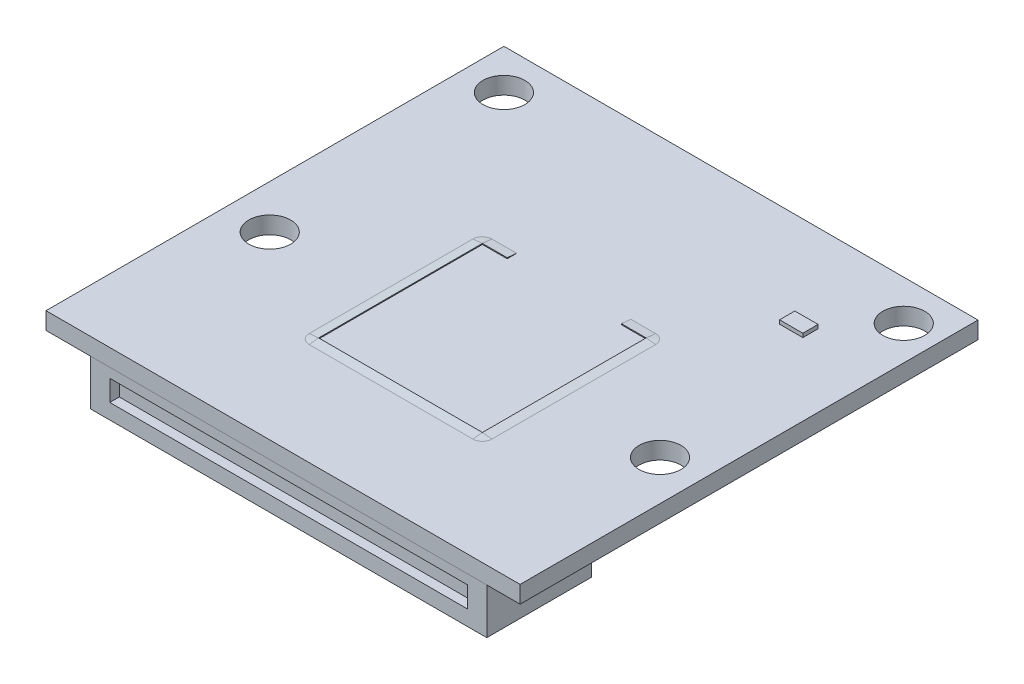
ISO-10303-21;
HEADER;
FILE_DESCRIPTION(('STEP AP214'),'2;1');
FILE_NAME('part.step','',(''),(''),'','','');
FILE_SCHEMA(('AUTOMOTIVE_DESIGN { 1 0 10303 214 1 1 1 1 }'));
ENDSEC;
DATA;
#1=APPLICATION_CONTEXT('core data for automotive mechanical design processes');
#2=APPLICATION_PROTOCOL_DEFINITION('international standard','automotive_design',2000,#1);
#3=PRODUCT_CONTEXT('',#1,'mechanical');
#4=PRODUCT('Part','Part','',(#3));
#5=PRODUCT_RELATED_PRODUCT_CATEGORY('part','',(#4));
#6=PRODUCT_DEFINITION_FORMATION('','',#4);
#7=PRODUCT_DEFINITION_CONTEXT('part definition',#1,'design');
#8=PRODUCT_DEFINITION('design','',#6,#7);
#9=PRODUCT_DEFINITION_SHAPE('','',#8);
#10=(LENGTH_UNIT() NAMED_UNIT(*) SI_UNIT(.MILLI.,.METRE.));
#11=(NAMED_UNIT(*) PLANE_ANGLE_UNIT() SI_UNIT($,.RADIAN.));
#12=(NAMED_UNIT(*) SI_UNIT($,.STERADIAN.) SOLID_ANGLE_UNIT());
#13=UNCERTAINTY_MEASURE_WITH_UNIT(LENGTH_MEASURE(1.E-05),#10,'distance_accuracy_value','');
#14=(GEOMETRIC_REPRESENTATION_CONTEXT(3) GLOBAL_UNCERTAINTY_ASSIGNED_CONTEXT((#13)) GLOBAL_UNIT_ASSIGNED_CONTEXT((#10,
#11,#12)) REPRESENTATION_CONTEXT('',''));
#15=CARTESIAN_POINT('',(0.,0.,0.));
#16=DIRECTION('',(0.,0.,1.));
#17=DIRECTION('',(1.,0.,0.));
#18=AXIS2_PLACEMENT_3D('',#15,#16,#17);
#19=CARTESIAN_POINT('',(-12.75,-0.9,10.17));
#20=DIRECTION('',(0.,0.,1.));
#21=DIRECTION('',(1.,0.,0.));
#22=AXIS2_PLACEMENT_3D('',#19,#20,#21);
#23=PLANE('',#22);
#24=DIRECTION('',(0.,-1.,0.));
#25=VECTOR('',#24,1.);
#26=CARTESIAN_POINT('',(-9.4,-1.4,10.17));
#27=LINE('',#26,#25);
#28=CARTESIAN_POINT('',(-9.4,-1.4,10.17));
#29=VERTEX_POINT('',#28);
#30=CARTESIAN_POINT('',(-9.4,-2.5,10.17));
#31=VERTEX_POINT('',#30);
#32=EDGE_CURVE('E223',#29,#31,#27,.T.);
#33=ORIENTED_EDGE('',*,*,#32,.F.);
#34=DIRECTION('',(-1.,0.,0.));
#35=VECTOR('',#34,1.);
#36=CARTESIAN_POINT('',(-9.4,-1.4,10.17));
#37=LINE('',#36,#35);
#38=CARTESIAN_POINT('',(9.4,-1.4,10.17));
#39=VERTEX_POINT('',#38);
#40=EDGE_CURVE('E240',#39,#29,#37,.T.);
#41=ORIENTED_EDGE('',*,*,#40,.F.);
#42=DIRECTION('',(0.,1.,0.));
#43=VECTOR('',#42,1.);
#44=CARTESIAN_POINT('',(9.4,-1.4,10.17));
#45=LINE('',#44,#43);
#46=CARTESIAN_POINT('',(9.4,-2.5,10.17));
#47=VERTEX_POINT('',#46);
#48=EDGE_CURVE('E243',#47,#39,#45,.T.);
#49=ORIENTED_EDGE('',*,*,#48,.F.);
#50=DIRECTION('',(1.,0.,0.));
#51=VECTOR('',#50,1.);
#52=CARTESIAN_POINT('',(-9.4,-2.5,10.17));
#53=LINE('',#52,#51);
#54=EDGE_CURVE('E249',#31,#47,#53,.T.);
#55=ORIENTED_EDGE('',*,*,#54,.F.);
#56=EDGE_LOOP('',(#33,#41,#49,#55));
#57=FACE_BOUND('',#56,.T.);
#58=DIRECTION('',(0.,1.,0.));
#59=VECTOR('',#58,1.);
#60=CARTESIAN_POINT('',(10.4,-3.3,10.17));
#61=LINE('',#60,#59);
#62=CARTESIAN_POINT('',(10.4,-3.3,10.17));
#63=VERTEX_POINT('',#62);
#64=CARTESIAN_POINT('',(10.4,-0.9,10.17));
#65=VERTEX_POINT('',#64);
#66=EDGE_CURVE('E313',#63,#65,#61,.T.);
#67=ORIENTED_EDGE('',*,*,#66,.T.);
#68=DIRECTION('',(-1.,0.,0.));
#69=VECTOR('',#68,1.);
#70=CARTESIAN_POINT('',(-12.75,-0.9,10.17));
#71=LINE('',#70,#69);
#72=CARTESIAN_POINT('',(-10.4,-0.9,10.17));
#73=VERTEX_POINT('',#72);
#74=EDGE_CURVE('E11',#65,#73,#71,.T.);
#75=ORIENTED_EDGE('',*,*,#74,.T.);
#76=DIRECTION('',(0.,1.,0.));
#77=VECTOR('',#76,1.);
#78=CARTESIAN_POINT('',(-10.4,-3.3,10.17));
#79=LINE('',#78,#77);
#80=CARTESIAN_POINT('',(-10.4,-3.3,10.17));
#81=VERTEX_POINT('',#80);
#82=EDGE_CURVE('E299',#81,#73,#79,.T.);
#83=ORIENTED_EDGE('',*,*,#82,.F.);
#84=DIRECTION('',(-1.,0.,0.));
#85=VECTOR('',#84,1.);
#86=CARTESIAN_POINT('',(-10.4,-3.3,10.17));
#87=LINE('',#86,#85);
#88=EDGE_CURVE('E297',#63,#81,#87,.T.);
#89=ORIENTED_EDGE('',*,*,#88,.F.);
#90=EDGE_LOOP('',(#67,#75,#83,#89));
#91=FACE_BOUND('',#90,.T.);
#92=ADVANCED_FACE('F36',(#57,#91),#23,.T.);
#93=CARTESIAN_POINT('',(0.,0.,0.));
#94=DIRECTION('',(0.,1.,0.));
#95=DIRECTION('',(0.,0.,1.));
#96=AXIS2_PLACEMENT_3D('',#93,#94,#95);
#97=PLANE('',#96);
#98=CARTESIAN_POINT('',(10.05,0.,0.720000000000005));
#99=DIRECTION('',(0.,1.,0.));
#100=DIRECTION('',(0.,0.,1.));
#101=AXIS2_PLACEMENT_3D('',#98,#99,#100);
#102=CIRCLE('',#101,1.1);
#103=CARTESIAN_POINT('',(10.05,0.,1.82000000000001));
#104=VERTEX_POINT('',#103);
#105=EDGE_CURVE('E405',#104,#104,#102,.T.);
#106=ORIENTED_EDGE('',*,*,#105,.F.);
#107=EDGE_LOOP('',(#106));
#108=FACE_BOUND('',#107,.T.);
#109=CARTESIAN_POINT('',(-10.45,0.,0.720000000000005));
#110=DIRECTION('',(0.,1.,0.));
#111=DIRECTION('',(0.,0.,1.));
#112=AXIS2_PLACEMENT_3D('',#109,#110,#111);
#113=CIRCLE('',#112,1.1);
#114=CARTESIAN_POINT('',(-10.45,0.,1.82000000000001));
#115=VERTEX_POINT('',#114);
#116=EDGE_CURVE('E409',#115,#115,#113,.T.);
#117=ORIENTED_EDGE('',*,*,#116,.F.);
#118=EDGE_LOOP('',(#117));
#119=FACE_BOUND('',#118,.T.);
#120=CARTESIAN_POINT('',(10.35,0.,-11.78));
#121=DIRECTION('',(0.,1.,0.));
#122=DIRECTION('',(0.,0.,1.));
#123=AXIS2_PLACEMENT_3D('',#120,#121,#122);
#124=CIRCLE('',#123,1.1);
#125=CARTESIAN_POINT('',(10.35,0.,-10.68));
#126=VERTEX_POINT('',#125);
#127=EDGE_CURVE('E415',#126,#126,#124,.T.);
#128=ORIENTED_EDGE('',*,*,#127,.F.);
#129=EDGE_LOOP('',(#128));
#130=FACE_BOUND('',#129,.T.);
#131=CARTESIAN_POINT('',(-10.65,0.,-11.78));
#132=DIRECTION('',(0.,1.,0.));
#133=DIRECTION('',(0.,0.,1.));
#134=AXIS2_PLACEMENT_3D('',#131,#132,#133);
#135=CIRCLE('',#134,1.1);
#136=CARTESIAN_POINT('',(-10.65,0.,-10.68));
#137=VERTEX_POINT('',#136);
#138=EDGE_CURVE('E421',#137,#137,#135,.T.);
#139=ORIENTED_EDGE('',*,*,#138,.F.);
#140=EDGE_LOOP('',(#139));
#141=FACE_BOUND('',#140,.T.);
#142=DIRECTION('',(0.,0.,1.));
#143=VECTOR('',#142,1.);
#144=CARTESIAN_POINT('',(-12.75,0.,-13.88));
#145=LINE('',#144,#143);
#146=CARTESIAN_POINT('',(-12.75,0.,-13.88));
#147=VERTEX_POINT('',#146);
#148=CARTESIAN_POINT('',(-12.75,0.,10.17));
#149=VERTEX_POINT('',#148);
#150=EDGE_CURVE('E427',#147,#149,#145,.T.);
#151=ORIENTED_EDGE('',*,*,#150,.T.);
#152=DIRECTION('',(1.,0.,0.));
#153=VECTOR('',#152,1.);
#154=CARTESIAN_POINT('',(-12.75,0.,10.17));
#155=LINE('',#154,#153);
#156=CARTESIAN_POINT('',(12.15,0.,10.17));
#157=VERTEX_POINT('',#156);
#158=EDGE_CURVE('E459',#149,#157,#155,.T.);
#159=ORIENTED_EDGE('',*,*,#158,.T.);
#160=DIRECTION('',(0.,0.,-1.));
#161=VECTOR('',#160,1.);
#162=CARTESIAN_POINT('',(12.15,0.,-13.88));
#163=LINE('',#162,#161);
#164=CARTESIAN_POINT('',(12.15,0.,-13.88));
#165=VERTEX_POINT('',#164);
#166=EDGE_CURVE('E456',#157,#165,#163,.T.);
#167=ORIENTED_EDGE('',*,*,#166,.T.);
#168=DIRECTION('',(-1.,0.,0.));
#169=VECTOR('',#168,1.);
#170=CARTESIAN_POINT('',(-12.75,0.,-13.88));
#171=LINE('',#170,#169);
#172=EDGE_CURVE('E434',#165,#147,#171,.T.);
#173=ORIENTED_EDGE('',*,*,#172,.T.);
#174=EDGE_LOOP('',(#151,#159,#167,#173));
#175=FACE_BOUND('',#174,.T.);
#176=DIRECTION('',(1.,0.,0.));
#177=VECTOR('',#176,1.);
#178=CARTESIAN_POINT('',(-4.3,0.,-4.3));
#179=LINE('',#178,#177);
#180=CARTESIAN_POINT('',(-4.3,0.,-4.3));
#181=VERTEX_POINT('',#180);
#182=CARTESIAN_POINT('',(-3.,0.,-4.3));
#183=VERTEX_POINT('',#182);
#184=EDGE_CURVE('E366',#181,#183,#179,.T.);
#185=ORIENTED_EDGE('',*,*,#184,.F.);
#186=DIRECTION('',(0.,0.,-1.));
#187=VECTOR('',#186,1.);
#188=CARTESIAN_POINT('',(-4.3,0.,-4.3));
#189=LINE('',#188,#187);
#190=CARTESIAN_POINT('',(-4.3,0.,4.3));
#191=VERTEX_POINT('',#190);
#192=EDGE_CURVE('E506',#191,#181,#189,.T.);
#193=ORIENTED_EDGE('',*,*,#192,.F.);
#194=DIRECTION('',(-1.,0.,0.));
#195=VECTOR('',#194,1.);
#196=CARTESIAN_POINT('',(-4.3,0.,4.3));
#197=LINE('',#196,#195);
#198=CARTESIAN_POINT('',(4.3,0.,4.3));
#199=VERTEX_POINT('',#198);
#200=EDGE_CURVE('E385',#199,#191,#197,.T.);
#201=ORIENTED_EDGE('',*,*,#200,.F.);
#202=DIRECTION('',(0.,0.,1.));
#203=VECTOR('',#202,1.);
#204=CARTESIAN_POINT('',(4.3,0.,-4.3));
#205=LINE('',#204,#203);
#206=CARTESIAN_POINT('',(4.3,0.,-4.3));
#207=VERTEX_POINT('',#206);
#208=EDGE_CURVE('E382',#207,#199,#205,.T.);
#209=ORIENTED_EDGE('',*,*,#208,.F.);
#210=DIRECTION('',(1.,0.,0.));
#211=VECTOR('',#210,1.);
#212=CARTESIAN_POINT('',(3.,0.,-4.3));
#213=LINE('',#212,#211);
#214=CARTESIAN_POINT('',(3.,0.,-4.3));
#215=VERTEX_POINT('',#214);
#216=EDGE_CURVE('E380',#215,#207,#213,.T.);
#217=ORIENTED_EDGE('',*,*,#216,.F.);
#218=DIRECTION('',(0.,0.,1.));
#219=VECTOR('',#218,1.);
#220=CARTESIAN_POINT('',(3.,0.,-4.8));
#221=LINE('',#220,#219);
#222=CARTESIAN_POINT('',(3.,0.,-4.8));
#223=VERTEX_POINT('',#222);
#224=EDGE_CURVE('E378',#223,#215,#221,.T.);
#225=ORIENTED_EDGE('',*,*,#224,.F.);
#226=DIRECTION('',(-1.,0.,0.));
#227=VECTOR('',#226,1.);
#228=CARTESIAN_POINT('',(3.,0.,-4.8));
#229=LINE('',#228,#227);
#230=CARTESIAN_POINT('',(4.3,0.,-4.8));
#231=VERTEX_POINT('',#230);
#232=EDGE_CURVE('E375',#231,#223,#229,.T.);
#233=ORIENTED_EDGE('',*,*,#232,.F.);
#234=CARTESIAN_POINT('',(4.3,0.,-4.3));
#235=DIRECTION('',(0.,1.,0.));
#236=DIRECTION('',(0.,0.,1.));
#237=AXIS2_PLACEMENT_3D('',#234,#235,#236);
#238=CIRCLE('',#237,0.5);
#239=CARTESIAN_POINT('',(4.8,0.,-4.3));
#240=VERTEX_POINT('',#239);
#241=EDGE_CURVE('E318',#231,#240,#238,.F.);
#242=ORIENTED_EDGE('',*,*,#241,.T.);
#243=DIRECTION('',(0.,0.,-1.));
#244=VECTOR('',#243,1.);
#245=CARTESIAN_POINT('',(4.8,0.,-4.8));
#246=LINE('',#245,#244);
#247=CARTESIAN_POINT('',(4.8,0.,4.3));
#248=VERTEX_POINT('',#247);
#249=EDGE_CURVE('E372',#248,#240,#246,.T.);
#250=ORIENTED_EDGE('',*,*,#249,.F.);
#251=CARTESIAN_POINT('',(4.3,0.,4.3));
#252=DIRECTION('',(0.,1.,0.));
#253=DIRECTION('',(0.,0.,1.));
#254=AXIS2_PLACEMENT_3D('',#251,#252,#253);
#255=CIRCLE('',#254,0.5);
#256=CARTESIAN_POINT('',(4.3,0.,4.8));
#257=VERTEX_POINT('',#256);
#258=EDGE_CURVE('E320',#248,#257,#255,.F.);
#259=ORIENTED_EDGE('',*,*,#258,.T.);
#260=DIRECTION('',(1.,0.,0.));
#261=VECTOR('',#260,1.);
#262=CARTESIAN_POINT('',(-4.8,0.,4.8));
#263=LINE('',#262,#261);
#264=CARTESIAN_POINT('',(-4.3,0.,4.8));
#265=VERTEX_POINT('',#264);
#266=EDGE_CURVE('E364',#265,#257,#263,.T.);
#267=ORIENTED_EDGE('',*,*,#266,.F.);
#268=CARTESIAN_POINT('',(-4.3,0.,4.3));
#269=DIRECTION('',(0.,1.,0.));
#270=DIRECTION('',(0.,0.,1.));
#271=AXIS2_PLACEMENT_3D('',#268,#269,#270);
#272=CIRCLE('',#271,0.5);
#273=CARTESIAN_POINT('',(-4.8,0.,4.3));
#274=VERTEX_POINT('',#273);
#275=EDGE_CURVE('E59',#265,#274,#272,.F.);
#276=ORIENTED_EDGE('',*,*,#275,.T.);
#277=DIRECTION('',(0.,0.,1.));
#278=VECTOR('',#277,1.);
#279=CARTESIAN_POINT('',(-4.8,0.,-4.8));
#280=LINE('',#279,#278);
#281=CARTESIAN_POINT('',(-4.8,0.,-4.3));
#282=VERTEX_POINT('',#281);
#283=EDGE_CURVE('E361',#282,#274,#280,.T.);
#284=ORIENTED_EDGE('',*,*,#283,.F.);
#285=CARTESIAN_POINT('',(-4.3,0.,-4.3));
#286=DIRECTION('',(0.,1.,0.));
#287=DIRECTION('',(0.,0.,1.));
#288=AXIS2_PLACEMENT_3D('',#285,#286,#287);
#289=CIRCLE('',#288,0.5);
#290=CARTESIAN_POINT('',(-4.3,0.,-4.8));
#291=VERTEX_POINT('',#290);
#292=EDGE_CURVE('E53',#282,#291,#289,.F.);
#293=ORIENTED_EDGE('',*,*,#292,.T.);
#294=DIRECTION('',(-1.,0.,0.));
#295=VECTOR('',#294,1.);
#296=CARTESIAN_POINT('',(-4.8,0.,-4.8));
#297=LINE('',#296,#295);
#298=CARTESIAN_POINT('',(-3.,0.,-4.8));
#299=VERTEX_POINT('',#298);
#300=EDGE_CURVE('E359',#299,#291,#297,.T.);
#301=ORIENTED_EDGE('',*,*,#300,.F.);
#302=DIRECTION('',(0.,0.,-1.));
#303=VECTOR('',#302,1.);
#304=CARTESIAN_POINT('',(-3.,0.,-4.8));
#305=LINE('',#304,#303);
#306=EDGE_CURVE('E362',#183,#299,#305,.T.);
#307=ORIENTED_EDGE('',*,*,#306,.F.);
#308=EDGE_LOOP('',(#185,#193,#201,#209,#217,#225,#233,#242,#250,#259,#267,#276,#284,#293,#301,#307));
#309=FACE_BOUND('',#308,.T.);
#310=DIRECTION('',(-1.,0.,0.));
#311=VECTOR('',#310,1.);
#312=CARTESIAN_POINT('',(8.35,0.,-9.28));
#313=LINE('',#312,#311);
#314=CARTESIAN_POINT('',(8.35,0.,-9.28));
#315=VERTEX_POINT('',#314);
#316=CARTESIAN_POINT('',(7.13,0.,-9.28));
#317=VERTEX_POINT('',#316);
#318=EDGE_CURVE('E273',#315,#317,#313,.T.);
#319=ORIENTED_EDGE('',*,*,#318,.F.);
#320=DIRECTION('',(0.,0.,-1.));
#321=VECTOR('',#320,1.);
#322=CARTESIAN_POINT('',(8.35,0.,-8.48));
#323=LINE('',#322,#321);
#324=CARTESIAN_POINT('',(8.35,0.,-8.48));
#325=VERTEX_POINT('',#324);
#326=EDGE_CURVE('E256',#325,#315,#323,.T.);
#327=ORIENTED_EDGE('',*,*,#326,.F.);
#328=DIRECTION('',(1.,0.,0.));
#329=VECTOR('',#328,1.);
#330=CARTESIAN_POINT('',(8.35,0.,-8.48));
#331=LINE('',#330,#329);
#332=CARTESIAN_POINT('',(7.13,0.,-8.48));
#333=VERTEX_POINT('',#332);
#334=EDGE_CURVE('E264',#333,#325,#331,.T.);
#335=ORIENTED_EDGE('',*,*,#334,.F.);
#336=DIRECTION('',(0.,0.,1.));
#337=VECTOR('',#336,1.);
#338=CARTESIAN_POINT('',(7.13,0.,-8.48));
#339=LINE('',#338,#337);
#340=EDGE_CURVE('E275',#317,#333,#339,.T.);
#341=ORIENTED_EDGE('',*,*,#340,.F.);
#342=EDGE_LOOP('',(#319,#327,#335,#341));
#343=FACE_BOUND('',#342,.T.);
#344=ADVANCED_FACE('F485',(#108,#119,#130,#141,#175,#309,#343),#97,.T.);
#345=CARTESIAN_POINT('',(0.,-0.9,0.));
#346=DIRECTION('',(0.,1.,0.));
#347=DIRECTION('',(0.,0.,1.));
#348=AXIS2_PLACEMENT_3D('',#345,#346,#347);
#349=PLANE('',#348);
#350=CARTESIAN_POINT('',(-10.65,-0.9,-11.78));
#351=DIRECTION('',(0.,1.,0.));
#352=DIRECTION('',(0.,0.,1.));
#353=AXIS2_PLACEMENT_3D('',#350,#351,#352);
#354=CIRCLE('',#353,1.1);
#355=CARTESIAN_POINT('',(-10.65,-0.9,-10.68));
#356=VERTEX_POINT('',#355);
#357=EDGE_CURVE('E424',#356,#356,#354,.T.);
#358=ORIENTED_EDGE('',*,*,#357,.T.);
#359=EDGE_LOOP('',(#358));
#360=FACE_BOUND('',#359,.T.);
#361=CARTESIAN_POINT('',(10.35,-0.9,-11.78));
#362=DIRECTION('',(0.,1.,0.));
#363=DIRECTION('',(0.,0.,1.));
#364=AXIS2_PLACEMENT_3D('',#361,#362,#363);
#365=CIRCLE('',#364,1.1);
#366=CARTESIAN_POINT('',(10.35,-0.9,-10.68));
#367=VERTEX_POINT('',#366);
#368=EDGE_CURVE('E418',#367,#367,#365,.T.);
#369=ORIENTED_EDGE('',*,*,#368,.T.);
#370=EDGE_LOOP('',(#369));
#371=FACE_BOUND('',#370,.T.);
#372=CARTESIAN_POINT('',(-10.45,-0.9,0.720000000000005));
#373=DIRECTION('',(0.,1.,0.));
#374=DIRECTION('',(0.,0.,1.));
#375=AXIS2_PLACEMENT_3D('',#372,#373,#374);
#376=CIRCLE('',#375,1.1);
#377=CARTESIAN_POINT('',(-10.45,-0.9,1.82000000000001));
#378=VERTEX_POINT('',#377);
#379=EDGE_CURVE('E412',#378,#378,#376,.T.);
#380=ORIENTED_EDGE('',*,*,#379,.T.);
#381=EDGE_LOOP('',(#380));
#382=FACE_BOUND('',#381,.T.);
#383=CARTESIAN_POINT('',(10.05,-0.9,0.720000000000005));
#384=DIRECTION('',(0.,1.,0.));
#385=DIRECTION('',(0.,0.,1.));
#386=AXIS2_PLACEMENT_3D('',#383,#384,#385);
#387=CIRCLE('',#386,1.1);
#388=CARTESIAN_POINT('',(10.05,-0.9,1.82000000000001));
#389=VERTEX_POINT('',#388);
#390=EDGE_CURVE('E406',#389,#389,#387,.T.);
#391=ORIENTED_EDGE('',*,*,#390,.T.);
#392=EDGE_LOOP('',(#391));
#393=FACE_BOUND('',#392,.T.);
#394=DIRECTION('',(0.,0.,-1.));
#395=VECTOR('',#394,1.);
#396=CARTESIAN_POINT('',(-10.4,-0.9,10.17));
#397=LINE('',#396,#395);
#398=CARTESIAN_POINT('',(-10.4,-0.9,4.67));
#399=VERTEX_POINT('',#398);
#400=EDGE_CURVE('E288',#73,#399,#397,.T.);
#401=ORIENTED_EDGE('',*,*,#400,.F.);
#402=DIRECTION('',(1.,0.,0.));
#403=VECTOR('',#402,1.);
#404=CARTESIAN_POINT('',(-12.75,-0.9,10.17));
#405=LINE('',#404,#403);
#406=CARTESIAN_POINT('',(-12.75,-0.9,10.17));
#407=VERTEX_POINT('',#406);
#408=EDGE_CURVE('E443',#407,#73,#405,.T.);
#409=ORIENTED_EDGE('',*,*,#408,.F.);
#410=DIRECTION('',(0.,0.,1.));
#411=VECTOR('',#410,1.);
#412=CARTESIAN_POINT('',(-12.75,-0.9,-13.88));
#413=LINE('',#412,#411);
#414=CARTESIAN_POINT('',(-12.75,-0.9,-13.88));
#415=VERTEX_POINT('',#414);
#416=EDGE_CURVE('E430',#415,#407,#413,.T.);
#417=ORIENTED_EDGE('',*,*,#416,.F.);
#418=DIRECTION('',(-1.,0.,0.));
#419=VECTOR('',#418,1.);
#420=CARTESIAN_POINT('',(-12.75,-0.9,-13.88));
#421=LINE('',#420,#419);
#422=CARTESIAN_POINT('',(12.15,-0.9,-13.88));
#423=VERTEX_POINT('',#422);
#424=EDGE_CURVE('E449',#423,#415,#421,.T.);
#425=ORIENTED_EDGE('',*,*,#424,.F.);
#426=DIRECTION('',(0.,0.,-1.));
#427=VECTOR('',#426,1.);
#428=CARTESIAN_POINT('',(12.15,-0.9,-13.88));
#429=LINE('',#428,#427);
#430=CARTESIAN_POINT('',(12.15,-0.9,10.17));
#431=VERTEX_POINT('',#430);
#432=EDGE_CURVE('E437',#431,#423,#429,.T.);
#433=ORIENTED_EDGE('',*,*,#432,.F.);
#434=EDGE_CURVE('E433',#65,#431,#405,.T.);
#435=ORIENTED_EDGE('',*,*,#434,.F.);
#436=DIRECTION('',(0.,0.,1.));
#437=VECTOR('',#436,1.);
#438=CARTESIAN_POINT('',(10.4,-0.9,10.17));
#439=LINE('',#438,#437);
#440=CARTESIAN_POINT('',(10.4,-0.9,4.67000000000001));
#441=VERTEX_POINT('',#440);
#442=EDGE_CURVE('E293',#441,#65,#439,.T.);
#443=ORIENTED_EDGE('',*,*,#442,.F.);
#444=DIRECTION('',(1.,0.,0.));
#445=VECTOR('',#444,1.);
#446=CARTESIAN_POINT('',(-10.4,-0.9,4.67));
#447=LINE('',#446,#445);
#448=EDGE_CURVE('E300',#399,#441,#447,.T.);
#449=ORIENTED_EDGE('',*,*,#448,.F.);
#450=EDGE_LOOP('',(#401,#409,#417,#425,#433,#435,#443,#449));
#451=FACE_BOUND('',#450,.T.);
#452=ADVANCED_FACE('F476',(#360,#371,#382,#393,#451),#349,.F.);
#453=CARTESIAN_POINT('',(-12.75,-0.9,-13.88));
#454=DIRECTION('',(-1.,0.,0.));
#455=DIRECTION('',(0.,0.,1.));
#456=AXIS2_PLACEMENT_3D('',#453,#454,#455);
#457=PLANE('',#456);
#458=ORIENTED_EDGE('',*,*,#150,.F.);
#459=DIRECTION('',(0.,1.,0.));
#460=VECTOR('',#459,1.);
#461=CARTESIAN_POINT('',(-12.75,-0.9,-13.88));
#462=LINE('',#461,#460);
#463=EDGE_CURVE('E321',#415,#147,#462,.T.);
#464=ORIENTED_EDGE('',*,*,#463,.F.);
#465=ORIENTED_EDGE('',*,*,#416,.T.);
#466=DIRECTION('',(0.,1.,0.));
#467=VECTOR('',#466,1.);
#468=CARTESIAN_POINT('',(-12.75,-0.9,10.17));
#469=LINE('',#468,#467);
#470=EDGE_CURVE('E446',#407,#149,#469,.T.);
#471=ORIENTED_EDGE('',*,*,#470,.T.);
#472=EDGE_LOOP('',(#458,#464,#465,#471));
#473=FACE_BOUND('',#472,.T.);
#474=ADVANCED_FACE('F480',(#473),#457,.T.);
#475=CARTESIAN_POINT('',(-12.75,-0.9,-13.88));
#476=DIRECTION('',(0.,0.,-1.));
#477=DIRECTION('',(-1.,0.,0.));
#478=AXIS2_PLACEMENT_3D('',#475,#476,#477);
#479=PLANE('',#478);
#480=ORIENTED_EDGE('',*,*,#172,.F.);
#481=DIRECTION('',(0.,1.,0.));
#482=VECTOR('',#481,1.);
#483=CARTESIAN_POINT('',(12.15,-0.9,-13.88));
#484=LINE('',#483,#482);
#485=EDGE_CURVE('E451',#423,#165,#484,.T.);
#486=ORIENTED_EDGE('',*,*,#485,.F.);
#487=ORIENTED_EDGE('',*,*,#424,.T.);
#488=ORIENTED_EDGE('',*,*,#463,.T.);
#489=EDGE_LOOP('',(#480,#486,#487,#488));
#490=FACE_BOUND('',#489,.T.);
#491=ADVANCED_FACE('F483',(#490),#479,.T.);
#492=CARTESIAN_POINT('',(12.15,-0.9,-13.88));
#493=DIRECTION('',(1.,0.,0.));
#494=DIRECTION('',(0.,0.,-1.));
#495=AXIS2_PLACEMENT_3D('',#492,#493,#494);
#496=PLANE('',#495);
#497=ORIENTED_EDGE('',*,*,#166,.F.);
#498=DIRECTION('',(0.,1.,0.));
#499=VECTOR('',#498,1.);
#500=CARTESIAN_POINT('',(12.15,-0.9,10.17));
#501=LINE('',#500,#499);
#502=EDGE_CURVE('E448',#431,#157,#501,.T.);
#503=ORIENTED_EDGE('',*,*,#502,.F.);
#504=ORIENTED_EDGE('',*,*,#432,.T.);
#505=ORIENTED_EDGE('',*,*,#485,.T.);
#506=EDGE_LOOP('',(#497,#503,#504,#505));
#507=FACE_BOUND('',#506,.T.);
#508=ADVANCED_FACE('F471',(#507),#496,.T.);
#509=ORIENTED_EDGE('',*,*,#74,.F.);
#510=ORIENTED_EDGE('',*,*,#434,.T.);
#511=ORIENTED_EDGE('',*,*,#502,.T.);
#512=ORIENTED_EDGE('',*,*,#158,.F.);
#513=ORIENTED_EDGE('',*,*,#470,.F.);
#514=ORIENTED_EDGE('',*,*,#408,.T.);
#515=EDGE_LOOP('',(#509,#510,#511,#512,#513,#514));
#516=FACE_BOUND('',#515,.T.);
#517=ADVANCED_FACE('F487',(#516),#23,.T.);
#518=CARTESIAN_POINT('',(-10.65,-0.9,-11.78));
#519=DIRECTION('',(0.,1.,0.));
#520=DIRECTION('',(0.,0.,1.));
#521=AXIS2_PLACEMENT_3D('',#518,#519,#520);
#522=CYLINDRICAL_SURFACE('',#521,1.1);
#523=ORIENTED_EDGE('',*,*,#357,.F.);
#524=EDGE_LOOP('',(#523));
#525=FACE_BOUND('',#524,.T.);
#526=ORIENTED_EDGE('',*,*,#138,.T.);
#527=EDGE_LOOP('',(#526));
#528=FACE_BOUND('',#527,.T.);
#529=ADVANCED_FACE('F569',(#525,#528),#522,.F.);
#530=CARTESIAN_POINT('',(10.35,-0.9,-11.78));
#531=DIRECTION('',(0.,1.,0.));
#532=DIRECTION('',(0.,0.,1.));
#533=AXIS2_PLACEMENT_3D('',#530,#531,#532);
#534=CYLINDRICAL_SURFACE('',#533,1.1);
#535=ORIENTED_EDGE('',*,*,#368,.F.);
#536=EDGE_LOOP('',(#535));
#537=FACE_BOUND('',#536,.T.);
#538=ORIENTED_EDGE('',*,*,#127,.T.);
#539=EDGE_LOOP('',(#538));
#540=FACE_BOUND('',#539,.T.);
#541=ADVANCED_FACE('F574',(#537,#540),#534,.F.);
#542=CARTESIAN_POINT('',(-10.45,-0.9,0.720000000000005));
#543=DIRECTION('',(0.,1.,0.));
#544=DIRECTION('',(0.,0.,1.));
#545=AXIS2_PLACEMENT_3D('',#542,#543,#544);
#546=CYLINDRICAL_SURFACE('',#545,1.1);
#547=ORIENTED_EDGE('',*,*,#379,.F.);
#548=EDGE_LOOP('',(#547));
#549=FACE_BOUND('',#548,.T.);
#550=ORIENTED_EDGE('',*,*,#116,.T.);
#551=EDGE_LOOP('',(#550));
#552=FACE_BOUND('',#551,.T.);
#553=ADVANCED_FACE('F587',(#549,#552),#546,.F.);
#554=CARTESIAN_POINT('',(10.05,-0.9,0.720000000000005));
#555=DIRECTION('',(0.,1.,0.));
#556=DIRECTION('',(0.,0.,1.));
#557=AXIS2_PLACEMENT_3D('',#554,#555,#556);
#558=CYLINDRICAL_SURFACE('',#557,1.1);
#559=ORIENTED_EDGE('',*,*,#390,.F.);
#560=EDGE_LOOP('',(#559));
#561=FACE_BOUND('',#560,.T.);
#562=ORIENTED_EDGE('',*,*,#105,.T.);
#563=EDGE_LOOP('',(#562));
#564=FACE_BOUND('',#563,.T.);
#565=ADVANCED_FACE('F591',(#561,#564),#558,.F.);
#566=CARTESIAN_POINT('',(-4.3,0.05,-4.3));
#567=DIRECTION('',(-1.,0.,0.));
#568=DIRECTION('',(0.,0.,1.));
#569=AXIS2_PLACEMENT_3D('',#566,#567,#568);
#570=PLANE('',#569);
#571=ORIENTED_EDGE('',*,*,#192,.T.);
#572=DIRECTION('',(0.,-1.,0.));
#573=VECTOR('',#572,1.);
#574=CARTESIAN_POINT('',(-4.3,0.05,-4.3));
#575=LINE('',#574,#573);
#576=CARTESIAN_POINT('',(-4.3,0.05,-4.3));
#577=VERTEX_POINT('',#576);
#578=EDGE_CURVE('E403',#577,#181,#575,.T.);
#579=ORIENTED_EDGE('',*,*,#578,.F.);
#580=DIRECTION('',(0.,0.,-1.));
#581=VECTOR('',#580,1.);
#582=CARTESIAN_POINT('',(-4.3,0.05,-4.3));
#583=LINE('',#582,#581);
#584=CARTESIAN_POINT('',(-4.3,0.05,4.3));
#585=VERTEX_POINT('',#584);
#586=EDGE_CURVE('E387',#585,#577,#583,.T.);
#587=ORIENTED_EDGE('',*,*,#586,.F.);
#588=DIRECTION('',(0.,-1.,0.));
#589=VECTOR('',#588,1.);
#590=CARTESIAN_POINT('',(-4.3,0.05,4.3));
#591=LINE('',#590,#589);
#592=EDGE_CURVE('E388',#585,#191,#591,.T.);
#593=ORIENTED_EDGE('',*,*,#592,.T.);
#594=EDGE_LOOP('',(#571,#579,#587,#593));
#595=FACE_BOUND('',#594,.T.);
#596=ADVANCED_FACE('F595',(#595),#570,.F.);
#597=CARTESIAN_POINT('',(-4.3,0.05,-4.3));
#598=DIRECTION('',(0.,0.,-1.));
#599=DIRECTION('',(-1.,0.,0.));
#600=AXIS2_PLACEMENT_3D('',#597,#598,#599);
#601=PLANE('',#600);
#602=ORIENTED_EDGE('',*,*,#184,.T.);
#603=DIRECTION('',(0.,-1.,0.));
#604=VECTOR('',#603,1.);
#605=CARTESIAN_POINT('',(-3.,0.05,-4.3));
#606=LINE('',#605,#604);
#607=CARTESIAN_POINT('',(-3.,0.05,-4.3));
#608=VERTEX_POINT('',#607);
#609=EDGE_CURVE('E400',#608,#183,#606,.T.);
#610=ORIENTED_EDGE('',*,*,#609,.F.);
#611=DIRECTION('',(1.,0.,0.));
#612=VECTOR('',#611,1.);
#613=CARTESIAN_POINT('',(-4.3,0.05,-4.3));
#614=LINE('',#613,#612);
#615=EDGE_CURVE('E358',#577,#608,#614,.T.);
#616=ORIENTED_EDGE('',*,*,#615,.F.);
#617=ORIENTED_EDGE('',*,*,#578,.T.);
#618=EDGE_LOOP('',(#602,#610,#616,#617));
#619=FACE_BOUND('',#618,.T.);
#620=ADVANCED_FACE('F523',(#619),#601,.F.);
#621=CARTESIAN_POINT('',(-3.,0.05,-4.8));
#622=DIRECTION('',(-1.,0.,0.));
#623=DIRECTION('',(0.,0.,1.));
#624=AXIS2_PLACEMENT_3D('',#621,#622,#623);
#625=PLANE('',#624);
#626=ORIENTED_EDGE('',*,*,#306,.T.);
#627=DIRECTION('',(0.,0.0995037190209942,0.99503719020999));
#628=VECTOR('',#627,1.);
#629=CARTESIAN_POINT('',(-3.,0.05,-4.29999999999998));
#630=LINE('',#629,#628);
#631=EDGE_CURVE('E46',#299,#608,#630,.T.);
#632=ORIENTED_EDGE('',*,*,#631,.T.);
#633=ORIENTED_EDGE('',*,*,#609,.T.);
#634=EDGE_LOOP('',(#626,#632,#633));
#635=FACE_BOUND('',#634,.T.);
#636=ADVANCED_FACE('F527',(#635),#625,.F.);
#637=CARTESIAN_POINT('',(3.,0.05,-4.8));
#638=DIRECTION('',(1.,0.,0.));
#639=DIRECTION('',(0.,0.,-1.));
#640=AXIS2_PLACEMENT_3D('',#637,#638,#639);
#641=PLANE('',#640);
#642=DIRECTION('',(0.,-1.,0.));
#643=VECTOR('',#642,1.);
#644=CARTESIAN_POINT('',(3.,0.05,-4.3));
#645=LINE('',#644,#643);
#646=CARTESIAN_POINT('',(3.,0.05,-4.3));
#647=VERTEX_POINT('',#646);
#648=EDGE_CURVE('E397',#647,#215,#645,.T.);
#649=ORIENTED_EDGE('',*,*,#648,.F.);
#650=DIRECTION('',(0.,-0.0995037190209936,-0.99503719020999));
#651=VECTOR('',#650,1.);
#652=CARTESIAN_POINT('',(3.,0.05,-4.29999999999997));
#653=LINE('',#652,#651);
#654=EDGE_CURVE('E325',#647,#223,#653,.T.);
#655=ORIENTED_EDGE('',*,*,#654,.T.);
#656=ORIENTED_EDGE('',*,*,#224,.T.);
#657=EDGE_LOOP('',(#649,#655,#656));
#658=FACE_BOUND('',#657,.T.);
#659=ADVANCED_FACE('F604',(#658),#641,.F.);
#660=CARTESIAN_POINT('',(3.,0.05,-4.3));
#661=DIRECTION('',(0.,0.,-1.));
#662=DIRECTION('',(-1.,0.,0.));
#663=AXIS2_PLACEMENT_3D('',#660,#661,#662);
#664=PLANE('',#663);
#665=ORIENTED_EDGE('',*,*,#216,.T.);
#666=DIRECTION('',(0.,-1.,0.));
#667=VECTOR('',#666,1.);
#668=CARTESIAN_POINT('',(4.3,0.05,-4.3));
#669=LINE('',#668,#667);
#670=CARTESIAN_POINT('',(4.3,0.05,-4.3));
#671=VERTEX_POINT('',#670);
#672=EDGE_CURVE('E394',#671,#207,#669,.T.);
#673=ORIENTED_EDGE('',*,*,#672,.F.);
#674=DIRECTION('',(1.,0.,0.));
#675=VECTOR('',#674,1.);
#676=CARTESIAN_POINT('',(3.,0.05,-4.3));
#677=LINE('',#676,#675);
#678=EDGE_CURVE('E513',#647,#671,#677,.T.);
#679=ORIENTED_EDGE('',*,*,#678,.F.);
#680=ORIENTED_EDGE('',*,*,#648,.T.);
#681=EDGE_LOOP('',(#665,#673,#679,#680));
#682=FACE_BOUND('',#681,.T.);
#683=ADVANCED_FACE('F607',(#682),#664,.F.);
#684=CARTESIAN_POINT('',(4.3,0.05,-4.3));
#685=DIRECTION('',(1.,0.,0.));
#686=DIRECTION('',(0.,0.,-1.));
#687=AXIS2_PLACEMENT_3D('',#684,#685,#686);
#688=PLANE('',#687);
#689=ORIENTED_EDGE('',*,*,#208,.T.);
#690=DIRECTION('',(0.,-1.,0.));
#691=VECTOR('',#690,1.);
#692=CARTESIAN_POINT('',(4.3,0.05,4.3));
#693=LINE('',#692,#691);
#694=CARTESIAN_POINT('',(4.3,0.05,4.3));
#695=VERTEX_POINT('',#694);
#696=EDGE_CURVE('E391',#695,#199,#693,.T.);
#697=ORIENTED_EDGE('',*,*,#696,.F.);
#698=DIRECTION('',(0.,0.,1.));
#699=VECTOR('',#698,1.);
#700=CARTESIAN_POINT('',(4.3,0.05,-4.3));
#701=LINE('',#700,#699);
#702=EDGE_CURVE('E516',#671,#695,#701,.T.);
#703=ORIENTED_EDGE('',*,*,#702,.F.);
#704=ORIENTED_EDGE('',*,*,#672,.T.);
#705=EDGE_LOOP('',(#689,#697,#703,#704));
#706=FACE_BOUND('',#705,.T.);
#707=ADVANCED_FACE('F611',(#706),#688,.F.);
#708=CARTESIAN_POINT('',(-4.3,0.05,4.3));
#709=DIRECTION('',(0.,0.,1.));
#710=DIRECTION('',(1.,0.,0.));
#711=AXIS2_PLACEMENT_3D('',#708,#709,#710);
#712=PLANE('',#711);
#713=ORIENTED_EDGE('',*,*,#200,.T.);
#714=ORIENTED_EDGE('',*,*,#592,.F.);
#715=DIRECTION('',(-1.,0.,0.));
#716=VECTOR('',#715,1.);
#717=CARTESIAN_POINT('',(-4.3,0.05,4.3));
#718=LINE('',#717,#716);
#719=EDGE_CURVE('E392',#695,#585,#718,.T.);
#720=ORIENTED_EDGE('',*,*,#719,.F.);
#721=ORIENTED_EDGE('',*,*,#696,.T.);
#722=EDGE_LOOP('',(#713,#714,#720,#721));
#723=FACE_BOUND('',#722,.T.);
#724=ADVANCED_FACE('F615',(#723),#712,.F.);
#725=CARTESIAN_POINT('',(-10.4,-3.3,10.17));
#726=DIRECTION('',(1.,0.,0.));
#727=DIRECTION('',(0.,0.,-1.));
#728=AXIS2_PLACEMENT_3D('',#725,#726,#727);
#729=PLANE('',#728);
#730=ORIENTED_EDGE('',*,*,#400,.T.);
#731=DIRECTION('',(0.,1.,0.));
#732=VECTOR('',#731,1.);
#733=CARTESIAN_POINT('',(-10.4,-3.3,4.67));
#734=LINE('',#733,#732);
#735=CARTESIAN_POINT('',(-10.4,-3.3,4.67));
#736=VERTEX_POINT('',#735);
#737=EDGE_CURVE('E505',#736,#399,#734,.T.);
#738=ORIENTED_EDGE('',*,*,#737,.F.);
#739=DIRECTION('',(0.,0.,-1.));
#740=VECTOR('',#739,1.);
#741=CARTESIAN_POINT('',(-10.4,-3.3,10.17));
#742=LINE('',#741,#740);
#743=EDGE_CURVE('E289',#81,#736,#742,.T.);
#744=ORIENTED_EDGE('',*,*,#743,.F.);
#745=ORIENTED_EDGE('',*,*,#82,.T.);
#746=EDGE_LOOP('',(#730,#738,#744,#745));
#747=FACE_BOUND('',#746,.T.);
#748=ADVANCED_FACE('F619',(#747),#729,.F.);
#749=CARTESIAN_POINT('',(-10.4,-3.3,4.67));
#750=DIRECTION('',(0.,0.,1.));
#751=DIRECTION('',(1.,0.,0.));
#752=AXIS2_PLACEMENT_3D('',#749,#750,#751);
#753=PLANE('',#752);
#754=ORIENTED_EDGE('',*,*,#448,.T.);
#755=DIRECTION('',(0.,1.,0.));
#756=VECTOR('',#755,1.);
#757=CARTESIAN_POINT('',(10.4,-3.3,4.67000000000001));
#758=LINE('',#757,#756);
#759=CARTESIAN_POINT('',(10.4,-3.3,4.67000000000001));
#760=VERTEX_POINT('',#759);
#761=EDGE_CURVE('E305',#760,#441,#758,.T.);
#762=ORIENTED_EDGE('',*,*,#761,.F.);
#763=DIRECTION('',(1.,0.,0.));
#764=VECTOR('',#763,1.);
#765=CARTESIAN_POINT('',(-10.4,-3.3,4.67));
#766=LINE('',#765,#764);
#767=EDGE_CURVE('E292',#736,#760,#766,.T.);
#768=ORIENTED_EDGE('',*,*,#767,.F.);
#769=ORIENTED_EDGE('',*,*,#737,.T.);
#770=EDGE_LOOP('',(#754,#762,#768,#769));
#771=FACE_BOUND('',#770,.T.);
#772=ADVANCED_FACE('F504',(#771),#753,.F.);
#773=CARTESIAN_POINT('',(10.4,-3.3,10.17));
#774=DIRECTION('',(-1.,0.,0.));
#775=DIRECTION('',(0.,0.,1.));
#776=AXIS2_PLACEMENT_3D('',#773,#774,#775);
#777=PLANE('',#776);
#778=ORIENTED_EDGE('',*,*,#442,.T.);
#779=ORIENTED_EDGE('',*,*,#66,.F.);
#780=DIRECTION('',(0.,0.,1.));
#781=VECTOR('',#780,1.);
#782=CARTESIAN_POINT('',(10.4,-3.3,10.17));
#783=LINE('',#782,#781);
#784=EDGE_CURVE('E295',#760,#63,#783,.T.);
#785=ORIENTED_EDGE('',*,*,#784,.F.);
#786=ORIENTED_EDGE('',*,*,#761,.T.);
#787=EDGE_LOOP('',(#778,#779,#785,#786));
#788=FACE_BOUND('',#787,.T.);
#789=ADVANCED_FACE('F491',(#788),#777,.F.);
#790=CARTESIAN_POINT('',(0.,-3.3,0.));
#791=DIRECTION('',(0.,-1.,0.));
#792=DIRECTION('',(0.,0.,-1.));
#793=AXIS2_PLACEMENT_3D('',#790,#791,#792);
#794=PLANE('',#793);
#795=ORIENTED_EDGE('',*,*,#743,.T.);
#796=ORIENTED_EDGE('',*,*,#767,.T.);
#797=ORIENTED_EDGE('',*,*,#784,.T.);
#798=ORIENTED_EDGE('',*,*,#88,.T.);
#799=EDGE_LOOP('',(#795,#796,#797,#798));
#800=FACE_BOUND('',#799,.T.);
#801=ADVANCED_FACE('F500',(#800),#794,.T.);
#802=CARTESIAN_POINT('',(8.35,0.2,-8.48));
#803=DIRECTION('',(-1.,0.,0.));
#804=DIRECTION('',(0.,0.,1.));
#805=AXIS2_PLACEMENT_3D('',#802,#803,#804);
#806=PLANE('',#805);
#807=ORIENTED_EDGE('',*,*,#326,.T.);
#808=DIRECTION('',(0.,-1.,0.));
#809=VECTOR('',#808,1.);
#810=CARTESIAN_POINT('',(8.35,0.2,-9.28));
#811=LINE('',#810,#809);
#812=CARTESIAN_POINT('',(8.35,0.2,-9.28));
#813=VERTEX_POINT('',#812);
#814=EDGE_CURVE('E286',#813,#315,#811,.T.);
#815=ORIENTED_EDGE('',*,*,#814,.F.);
#816=DIRECTION('',(0.,0.,-1.));
#817=VECTOR('',#816,1.);
#818=CARTESIAN_POINT('',(8.35,0.2,-8.48));
#819=LINE('',#818,#817);
#820=CARTESIAN_POINT('',(8.35,0.2,-8.48));
#821=VERTEX_POINT('',#820);
#822=EDGE_CURVE('E260',#821,#813,#819,.T.);
#823=ORIENTED_EDGE('',*,*,#822,.F.);
#824=DIRECTION('',(0.,-1.,0.));
#825=VECTOR('',#824,1.);
#826=CARTESIAN_POINT('',(8.35,0.2,-8.48));
#827=LINE('',#826,#825);
#828=EDGE_CURVE('E270',#821,#325,#827,.T.);
#829=ORIENTED_EDGE('',*,*,#828,.T.);
#830=EDGE_LOOP('',(#807,#815,#823,#829));
#831=FACE_BOUND('',#830,.T.);
#832=ADVANCED_FACE('F550',(#831),#806,.F.);
#833=CARTESIAN_POINT('',(8.35,0.2,-9.28));
#834=DIRECTION('',(0.,0.,1.));
#835=DIRECTION('',(1.,0.,0.));
#836=AXIS2_PLACEMENT_3D('',#833,#834,#835);
#837=PLANE('',#836);
#838=ORIENTED_EDGE('',*,*,#318,.T.);
#839=DIRECTION('',(0.,-1.,0.));
#840=VECTOR('',#839,1.);
#841=CARTESIAN_POINT('',(7.13,0.2,-9.28));
#842=LINE('',#841,#840);
#843=CARTESIAN_POINT('',(7.13,0.2,-9.28));
#844=VERTEX_POINT('',#843);
#845=EDGE_CURVE('E283',#844,#317,#842,.T.);
#846=ORIENTED_EDGE('',*,*,#845,.F.);
#847=DIRECTION('',(-1.,0.,0.));
#848=VECTOR('',#847,1.);
#849=CARTESIAN_POINT('',(8.35,0.2,-9.28));
#850=LINE('',#849,#848);
#851=EDGE_CURVE('E263',#813,#844,#850,.T.);
#852=ORIENTED_EDGE('',*,*,#851,.F.);
#853=ORIENTED_EDGE('',*,*,#814,.T.);
#854=EDGE_LOOP('',(#838,#846,#852,#853));
#855=FACE_BOUND('',#854,.T.);
#856=ADVANCED_FACE('F538',(#855),#837,.F.);
#857=CARTESIAN_POINT('',(7.13,0.2,-8.48));
#858=DIRECTION('',(1.,0.,0.));
#859=DIRECTION('',(0.,0.,-1.));
#860=AXIS2_PLACEMENT_3D('',#857,#858,#859);
#861=PLANE('',#860);
#862=ORIENTED_EDGE('',*,*,#340,.T.);
#863=DIRECTION('',(0.,-1.,0.));
#864=VECTOR('',#863,1.);
#865=CARTESIAN_POINT('',(7.13,0.2,-8.48));
#866=LINE('',#865,#864);
#867=CARTESIAN_POINT('',(7.13,0.2,-8.48));
#868=VERTEX_POINT('',#867);
#869=EDGE_CURVE('E281',#868,#333,#866,.T.);
#870=ORIENTED_EDGE('',*,*,#869,.F.);
#871=DIRECTION('',(0.,0.,1.));
#872=VECTOR('',#871,1.);
#873=CARTESIAN_POINT('',(7.13,0.2,-8.48));
#874=LINE('',#873,#872);
#875=EDGE_CURVE('E266',#844,#868,#874,.T.);
#876=ORIENTED_EDGE('',*,*,#875,.F.);
#877=ORIENTED_EDGE('',*,*,#845,.T.);
#878=EDGE_LOOP('',(#862,#870,#876,#877));
#879=FACE_BOUND('',#878,.T.);
#880=ADVANCED_FACE('F542',(#879),#861,.F.);
#881=CARTESIAN_POINT('',(8.35,0.2,-8.48));
#882=DIRECTION('',(0.,0.,-1.));
#883=DIRECTION('',(-1.,0.,0.));
#884=AXIS2_PLACEMENT_3D('',#881,#882,#883);
#885=PLANE('',#884);
#886=ORIENTED_EDGE('',*,*,#334,.T.);
#887=ORIENTED_EDGE('',*,*,#828,.F.);
#888=DIRECTION('',(1.,0.,0.));
#889=VECTOR('',#888,1.);
#890=CARTESIAN_POINT('',(8.35,0.2,-8.48));
#891=LINE('',#890,#889);
#892=EDGE_CURVE('E268',#868,#821,#891,.T.);
#893=ORIENTED_EDGE('',*,*,#892,.F.);
#894=ORIENTED_EDGE('',*,*,#869,.T.);
#895=EDGE_LOOP('',(#886,#887,#893,#894));
#896=FACE_BOUND('',#895,.T.);
#897=ADVANCED_FACE('F552',(#896),#885,.F.);
#898=CARTESIAN_POINT('',(0.,0.2,0.));
#899=DIRECTION('',(0.,1.,0.));
#900=DIRECTION('',(0.,0.,1.));
#901=AXIS2_PLACEMENT_3D('',#898,#899,#900);
#902=PLANE('',#901);
#903=ORIENTED_EDGE('',*,*,#822,.T.);
#904=ORIENTED_EDGE('',*,*,#851,.T.);
#905=ORIENTED_EDGE('',*,*,#875,.T.);
#906=ORIENTED_EDGE('',*,*,#892,.T.);
#907=EDGE_LOOP('',(#903,#904,#905,#906));
#908=FACE_BOUND('',#907,.T.);
#909=ADVANCED_FACE('F546',(#908),#902,.T.);
#910=CARTESIAN_POINT('',(-9.4,-1.4,9.67));
#911=DIRECTION('',(-1.,0.,0.));
#912=DIRECTION('',(0.,0.,1.));
#913=AXIS2_PLACEMENT_3D('',#910,#911,#912);
#914=PLANE('',#913);
#915=ORIENTED_EDGE('',*,*,#32,.T.);
#916=DIRECTION('',(0.,0.,1.));
#917=VECTOR('',#916,1.);
#918=CARTESIAN_POINT('',(-9.4,-2.5,9.67));
#919=LINE('',#918,#917);
#920=CARTESIAN_POINT('',(-9.4,-2.5,9.67));
#921=VERTEX_POINT('',#920);
#922=EDGE_CURVE('E216',#921,#31,#919,.T.);
#923=ORIENTED_EDGE('',*,*,#922,.F.);
#924=DIRECTION('',(0.,-1.,0.));
#925=VECTOR('',#924,1.);
#926=CARTESIAN_POINT('',(-9.4,-1.4,9.67));
#927=LINE('',#926,#925);
#928=CARTESIAN_POINT('',(-9.4,-1.4,9.67));
#929=VERTEX_POINT('',#928);
#930=EDGE_CURVE('E220',#929,#921,#927,.T.);
#931=ORIENTED_EDGE('',*,*,#930,.F.);
#932=DIRECTION('',(0.,0.,1.));
#933=VECTOR('',#932,1.);
#934=CARTESIAN_POINT('',(-9.4,-1.4,9.67));
#935=LINE('',#934,#933);
#936=EDGE_CURVE('E254',#929,#29,#935,.T.);
#937=ORIENTED_EDGE('',*,*,#936,.T.);
#938=EDGE_LOOP('',(#915,#923,#931,#937));
#939=FACE_BOUND('',#938,.T.);
#940=ADVANCED_FACE('F218',(#939),#914,.F.);
#941=CARTESIAN_POINT('',(-9.4,-1.4,9.67));
#942=DIRECTION('',(0.,1.,0.));
#943=DIRECTION('',(0.,0.,1.));
#944=AXIS2_PLACEMENT_3D('',#941,#942,#943);
#945=PLANE('',#944);
#946=ORIENTED_EDGE('',*,*,#40,.T.);
#947=ORIENTED_EDGE('',*,*,#936,.F.);
#948=DIRECTION('',(-1.,0.,0.));
#949=VECTOR('',#948,1.);
#950=CARTESIAN_POINT('',(-9.4,-1.4,9.67));
#951=LINE('',#950,#949);
#952=CARTESIAN_POINT('',(9.4,-1.4,9.67));
#953=VERTEX_POINT('',#952);
#954=EDGE_CURVE('E228',#953,#929,#951,.T.);
#955=ORIENTED_EDGE('',*,*,#954,.F.);
#956=DIRECTION('',(0.,0.,1.));
#957=VECTOR('',#956,1.);
#958=CARTESIAN_POINT('',(9.4,-1.4,9.67));
#959=LINE('',#958,#957);
#960=EDGE_CURVE('E257',#953,#39,#959,.T.);
#961=ORIENTED_EDGE('',*,*,#960,.T.);
#962=EDGE_LOOP('',(#946,#947,#955,#961));
#963=FACE_BOUND('',#962,.T.);
#964=ADVANCED_FACE('F663',(#963),#945,.F.);
#965=CARTESIAN_POINT('',(9.4,-1.4,9.67));
#966=DIRECTION('',(1.,0.,0.));
#967=DIRECTION('',(0.,0.,-1.));
#968=AXIS2_PLACEMENT_3D('',#965,#966,#967);
#969=PLANE('',#968);
#970=ORIENTED_EDGE('',*,*,#48,.T.);
#971=ORIENTED_EDGE('',*,*,#960,.F.);
#972=DIRECTION('',(0.,1.,0.));
#973=VECTOR('',#972,1.);
#974=CARTESIAN_POINT('',(9.4,-1.4,9.67));
#975=LINE('',#974,#973);
#976=CARTESIAN_POINT('',(9.4,-2.5,9.67));
#977=VERTEX_POINT('',#976);
#978=EDGE_CURVE('E236',#977,#953,#975,.T.);
#979=ORIENTED_EDGE('',*,*,#978,.F.);
#980=DIRECTION('',(0.,0.,1.));
#981=VECTOR('',#980,1.);
#982=CARTESIAN_POINT('',(9.4,-2.5,9.67));
#983=LINE('',#982,#981);
#984=EDGE_CURVE('E227',#977,#47,#983,.T.);
#985=ORIENTED_EDGE('',*,*,#984,.T.);
#986=EDGE_LOOP('',(#970,#971,#979,#985));
#987=FACE_BOUND('',#986,.T.);
#988=ADVANCED_FACE('F672',(#987),#969,.F.);
#989=CARTESIAN_POINT('',(-9.4,-2.5,9.67));
#990=DIRECTION('',(0.,-1.,0.));
#991=DIRECTION('',(0.,0.,-1.));
#992=AXIS2_PLACEMENT_3D('',#989,#990,#991);
#993=PLANE('',#992);
#994=ORIENTED_EDGE('',*,*,#54,.T.);
#995=ORIENTED_EDGE('',*,*,#984,.F.);
#996=DIRECTION('',(1.,0.,0.));
#997=VECTOR('',#996,1.);
#998=CARTESIAN_POINT('',(-9.4,-2.5,9.67));
#999=LINE('',#998,#997);
#1000=EDGE_CURVE('E231',#921,#977,#999,.T.);
#1001=ORIENTED_EDGE('',*,*,#1000,.F.);
#1002=ORIENTED_EDGE('',*,*,#922,.T.);
#1003=EDGE_LOOP('',(#994,#995,#1001,#1002));
#1004=FACE_BOUND('',#1003,.T.);
#1005=ADVANCED_FACE('F232',(#1004),#993,.F.);
#1006=CARTESIAN_POINT('',(0.,0.,9.67));
#1007=DIRECTION('',(0.,0.,1.));
#1008=DIRECTION('',(1.,0.,0.));
#1009=AXIS2_PLACEMENT_3D('',#1006,#1007,#1008);
#1010=PLANE('',#1009);
#1011=ORIENTED_EDGE('',*,*,#930,.T.);
#1012=ORIENTED_EDGE('',*,*,#1000,.T.);
#1013=ORIENTED_EDGE('',*,*,#978,.T.);
#1014=ORIENTED_EDGE('',*,*,#954,.T.);
#1015=EDGE_LOOP('',(#1011,#1012,#1013,#1014));
#1016=FACE_BOUND('',#1015,.T.);
#1017=ADVANCED_FACE('F238',(#1016),#1010,.T.);
#1018=CARTESIAN_POINT('',(0.,0.05,-4.29999999999998));
#1019=DIRECTION('',(0.,0.99503719020999,-0.0995037190209941));
#1020=DIRECTION('',(1.,0.,0.));
#1021=AXIS2_PLACEMENT_3D('',#1018,#1019,#1020);
#1022=PLANE('',#1021);
#1023=ORIENTED_EDGE('',*,*,#631,.F.);
#1024=ORIENTED_EDGE('',*,*,#300,.T.);
#1025=DIRECTION('',(0.,-0.0995037190209941,-0.99503719020999));
#1026=VECTOR('',#1025,1.);
#1027=CARTESIAN_POINT('',(-4.3,0.05,-4.29999999999998));
#1028=LINE('',#1027,#1026);
#1029=EDGE_CURVE('E250',#577,#291,#1028,.T.);
#1030=ORIENTED_EDGE('',*,*,#1029,.F.);
#1031=ORIENTED_EDGE('',*,*,#615,.T.);
#1032=EDGE_LOOP('',(#1023,#1024,#1030,#1031));
#1033=FACE_BOUND('',#1032,.T.);
#1034=ADVANCED_FACE('F38',(#1033),#1022,.T.);
#1035=CARTESIAN_POINT('',(-4.3,0.,-4.3));
#1036=DIRECTION('',(0.,-1.,0.));
#1037=DIRECTION('',(0.,0.,-1.));
#1038=AXIS2_PLACEMENT_3D('',#1035,#1036,#1037);
#1039=CONICAL_SURFACE('',#1038,0.500000000000021,1.47112767430374);
#1040=ORIENTED_EDGE('',*,*,#1029,.T.);
#1041=ORIENTED_EDGE('',*,*,#292,.F.);
#1042=DIRECTION('',(-0.99503719020999,-0.0995037190209928,0.));
#1043=VECTOR('',#1042,1.);
#1044=CARTESIAN_POINT('',(-4.29999999999997,0.05,-4.3));
#1045=LINE('',#1044,#1043);
#1046=EDGE_CURVE('E346',#577,#282,#1045,.T.);
#1047=ORIENTED_EDGE('',*,*,#1046,.F.);
#1048=EDGE_LOOP('',(#1040,#1041,#1047));
#1049=FACE_BOUND('',#1048,.T.);
#1050=ADVANCED_FACE('F353',(#1049),#1039,.T.);
#1051=CARTESIAN_POINT('',(-4.29999999999997,0.05,0.));
#1052=DIRECTION('',(-0.0995037190209936,0.99503719020999,0.));
#1053=DIRECTION('',(0.,0.,-1.));
#1054=AXIS2_PLACEMENT_3D('',#1051,#1052,#1053);
#1055=PLANE('',#1054);
#1056=ORIENTED_EDGE('',*,*,#1046,.T.);
#1057=ORIENTED_EDGE('',*,*,#283,.T.);
#1058=DIRECTION('',(-0.99503719020999,-0.0995037190209936,0.));
#1059=VECTOR('',#1058,1.);
#1060=CARTESIAN_POINT('',(-4.29999999999997,0.05,4.3));
#1061=LINE('',#1060,#1059);
#1062=EDGE_CURVE('E343',#585,#274,#1061,.T.);
#1063=ORIENTED_EDGE('',*,*,#1062,.F.);
#1064=ORIENTED_EDGE('',*,*,#586,.T.);
#1065=EDGE_LOOP('',(#1056,#1057,#1063,#1064));
#1066=FACE_BOUND('',#1065,.T.);
#1067=ADVANCED_FACE('F763',(#1066),#1055,.T.);
#1068=CARTESIAN_POINT('',(-4.3,0.,4.3));
#1069=DIRECTION('',(0.,-1.,0.));
#1070=DIRECTION('',(0.,0.,-1.));
#1071=AXIS2_PLACEMENT_3D('',#1068,#1069,#1070);
#1072=CONICAL_SURFACE('',#1071,0.500000000000021,1.47112767430374);
#1073=ORIENTED_EDGE('',*,*,#1062,.T.);
#1074=ORIENTED_EDGE('',*,*,#275,.F.);
#1075=DIRECTION('',(0.,-0.0995037190209941,0.99503719020999));
#1076=VECTOR('',#1075,1.);
#1077=CARTESIAN_POINT('',(-4.3,0.05,4.29999999999998));
#1078=LINE('',#1077,#1076);
#1079=EDGE_CURVE('E340',#585,#265,#1078,.T.);
#1080=ORIENTED_EDGE('',*,*,#1079,.F.);
#1081=EDGE_LOOP('',(#1073,#1074,#1080));
#1082=FACE_BOUND('',#1081,.T.);
#1083=ADVANCED_FACE('F771',(#1082),#1072,.T.);
#1084=CARTESIAN_POINT('',(0.,0.05,4.29999999999998));
#1085=DIRECTION('',(0.,0.99503719020999,0.0995037190209941));
#1086=DIRECTION('',(-1.,0.,0.));
#1087=AXIS2_PLACEMENT_3D('',#1084,#1085,#1086);
#1088=PLANE('',#1087);
#1089=ORIENTED_EDGE('',*,*,#1079,.T.);
#1090=ORIENTED_EDGE('',*,*,#266,.T.);
#1091=DIRECTION('',(0.,-0.0995037190209941,0.99503719020999));
#1092=VECTOR('',#1091,1.);
#1093=CARTESIAN_POINT('',(4.3,0.05,4.29999999999998));
#1094=LINE('',#1093,#1092);
#1095=EDGE_CURVE('E337',#695,#257,#1094,.T.);
#1096=ORIENTED_EDGE('',*,*,#1095,.F.);
#1097=ORIENTED_EDGE('',*,*,#719,.T.);
#1098=EDGE_LOOP('',(#1089,#1090,#1096,#1097));
#1099=FACE_BOUND('',#1098,.T.);
#1100=ADVANCED_FACE('F781',(#1099),#1088,.T.);
#1101=CARTESIAN_POINT('',(4.3,0.,4.3));
#1102=DIRECTION('',(0.,-1.,0.));
#1103=DIRECTION('',(0.,0.,-1.));
#1104=AXIS2_PLACEMENT_3D('',#1101,#1102,#1103);
#1105=CONICAL_SURFACE('',#1104,0.500000000000021,1.47112767430374);
#1106=ORIENTED_EDGE('',*,*,#1095,.T.);
#1107=ORIENTED_EDGE('',*,*,#258,.F.);
#1108=DIRECTION('',(0.99503719020999,-0.0995037190209941,0.));
#1109=VECTOR('',#1108,1.);
#1110=CARTESIAN_POINT('',(4.29999999999998,0.05,4.3));
#1111=LINE('',#1110,#1109);
#1112=EDGE_CURVE('E334',#695,#248,#1111,.T.);
#1113=ORIENTED_EDGE('',*,*,#1112,.F.);
#1114=EDGE_LOOP('',(#1106,#1107,#1113));
#1115=FACE_BOUND('',#1114,.T.);
#1116=ADVANCED_FACE('F791',(#1115),#1105,.T.);
#1117=CARTESIAN_POINT('',(4.29999999999998,0.05,0.));
#1118=DIRECTION('',(0.0995037190209941,0.99503719020999,0.));
#1119=DIRECTION('',(0.,0.,1.));
#1120=AXIS2_PLACEMENT_3D('',#1117,#1118,#1119);
#1121=PLANE('',#1120);
#1122=ORIENTED_EDGE('',*,*,#1112,.T.);
#1123=ORIENTED_EDGE('',*,*,#249,.T.);
#1124=DIRECTION('',(0.99503719020999,-0.0995037190209941,0.));
#1125=VECTOR('',#1124,1.);
#1126=CARTESIAN_POINT('',(4.29999999999998,0.05,-4.3));
#1127=LINE('',#1126,#1125);
#1128=EDGE_CURVE('E331',#671,#240,#1127,.T.);
#1129=ORIENTED_EDGE('',*,*,#1128,.F.);
#1130=ORIENTED_EDGE('',*,*,#702,.T.);
#1131=EDGE_LOOP('',(#1122,#1123,#1129,#1130));
#1132=FACE_BOUND('',#1131,.T.);
#1133=ADVANCED_FACE('F801',(#1132),#1121,.T.);
#1134=CARTESIAN_POINT('',(4.3,0.,-4.3));
#1135=DIRECTION('',(0.,-1.,0.));
#1136=DIRECTION('',(0.,0.,-1.));
#1137=AXIS2_PLACEMENT_3D('',#1134,#1135,#1136);
#1138=CONICAL_SURFACE('',#1137,0.500000000000021,1.47112767430374);
#1139=ORIENTED_EDGE('',*,*,#1128,.T.);
#1140=ORIENTED_EDGE('',*,*,#241,.F.);
#1141=DIRECTION('',(0.,-0.0995037190209928,-0.99503719020999));
#1142=VECTOR('',#1141,1.);
#1143=CARTESIAN_POINT('',(4.3,0.05,-4.29999999999997));
#1144=LINE('',#1143,#1142);
#1145=EDGE_CURVE('E328',#671,#231,#1144,.T.);
#1146=ORIENTED_EDGE('',*,*,#1145,.F.);
#1147=EDGE_LOOP('',(#1139,#1140,#1146));
#1148=FACE_BOUND('',#1147,.T.);
#1149=ADVANCED_FACE('F811',(#1148),#1138,.T.);
#1150=CARTESIAN_POINT('',(0.,0.05,-4.29999999999997));
#1151=DIRECTION('',(0.,0.99503719020999,-0.0995037190209936));
#1152=DIRECTION('',(1.,0.,0.));
#1153=AXIS2_PLACEMENT_3D('',#1150,#1151,#1152);
#1154=PLANE('',#1153);
#1155=ORIENTED_EDGE('',*,*,#1145,.T.);
#1156=ORIENTED_EDGE('',*,*,#232,.T.);
#1157=ORIENTED_EDGE('',*,*,#654,.F.);
#1158=ORIENTED_EDGE('',*,*,#678,.T.);
#1159=EDGE_LOOP('',(#1155,#1156,#1157,#1158));
#1160=FACE_BOUND('',#1159,.T.);
#1161=ADVANCED_FACE('F821',(#1160),#1154,.T.);
#1162=CLOSED_SHELL('',(#92,#344,#452,#474,#491,#508,#517,#529,#541,#553,#565,#596,#620,#636,
#659,#683,#707,#724,#748,#772,#789,#801,#832,#856,#880,#897,#909,#940,#964,#988,#1005,#1017,
#1034,#1050,#1067,#1083,#1100,#1116,#1133,#1149,#1161));
#1163=MANIFOLD_SOLID_BREP('B2',#1162);
#1164=ADVANCED_BREP_SHAPE_REPRESENTATION('',(#18,#1163),#14);
#1165=SHAPE_DEFINITION_REPRESENTATION(#9,#1164);
ENDSEC;
END-ISO-10303-21;
